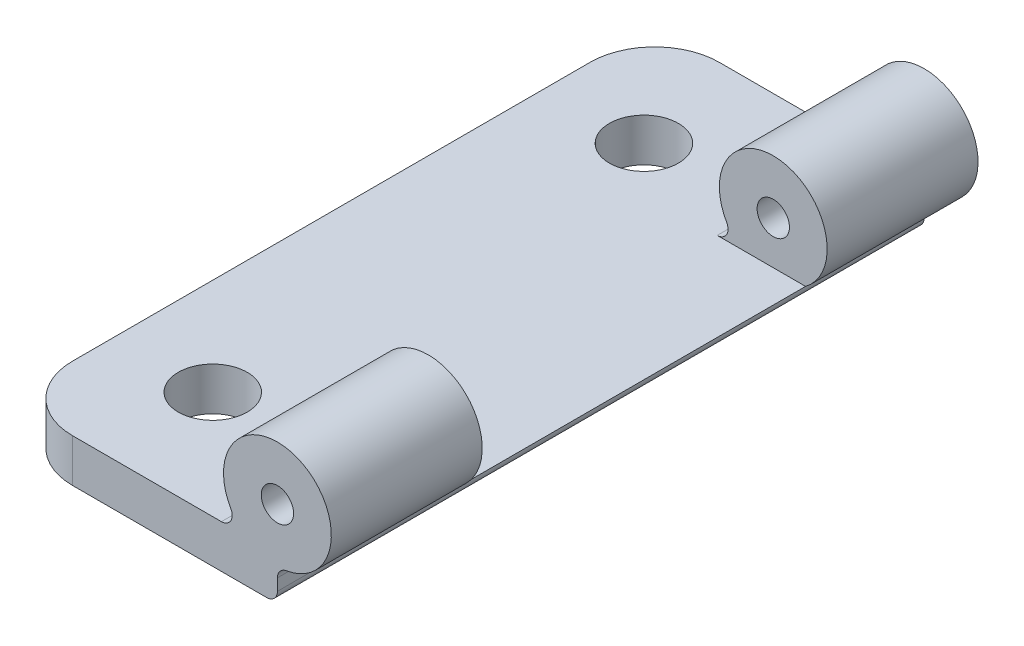
ISO-10303-21;
HEADER;
FILE_DESCRIPTION(('STEP AP214'),'2;1');
FILE_NAME('part.step','',(''),(''),'','','');
FILE_SCHEMA(('AUTOMOTIVE_DESIGN { 1 0 10303 214 1 1 1 1 }'));
ENDSEC;
DATA;
#1=APPLICATION_CONTEXT('core data for automotive mechanical design processes');
#2=APPLICATION_PROTOCOL_DEFINITION('international standard','automotive_design',2000,#1);
#3=PRODUCT_CONTEXT('',#1,'mechanical');
#4=PRODUCT('Part','Part','',(#3));
#5=PRODUCT_RELATED_PRODUCT_CATEGORY('part','',(#4));
#6=PRODUCT_DEFINITION_FORMATION('','',#4);
#7=PRODUCT_DEFINITION_CONTEXT('part definition',#1,'design');
#8=PRODUCT_DEFINITION('design','',#6,#7);
#9=PRODUCT_DEFINITION_SHAPE('','',#8);
#10=(LENGTH_UNIT() NAMED_UNIT(*) SI_UNIT(.MILLI.,.METRE.));
#11=(NAMED_UNIT(*) PLANE_ANGLE_UNIT() SI_UNIT($,.RADIAN.));
#12=(NAMED_UNIT(*) SI_UNIT($,.STERADIAN.) SOLID_ANGLE_UNIT());
#13=UNCERTAINTY_MEASURE_WITH_UNIT(LENGTH_MEASURE(1.E-05),#10,'distance_accuracy_value','');
#14=(GEOMETRIC_REPRESENTATION_CONTEXT(3) GLOBAL_UNCERTAINTY_ASSIGNED_CONTEXT((#13)) GLOBAL_UNIT_ASSIGNED_CONTEXT((#10,
#11,#12)) REPRESENTATION_CONTEXT('',''));
#15=CARTESIAN_POINT('',(0.,0.,0.));
#16=DIRECTION('',(0.,0.,1.));
#17=DIRECTION('',(1.,0.,0.));
#18=AXIS2_PLACEMENT_3D('',#15,#16,#17);
#19=CARTESIAN_POINT('',(12.5,4.,-7.07106781186548));
#20=DIRECTION('',(0.,0.,1.));
#21=DIRECTION('',(1.,0.,0.));
#22=AXIS2_PLACEMENT_3D('',#19,#20,#21);
#23=CYLINDRICAL_SURFACE('',#22,2.5);
#24=CARTESIAN_POINT('',(12.5,4.,23.));
#25=DIRECTION('',(0.,0.,-1.));
#26=DIRECTION('',(-1.,0.,0.));
#27=AXIS2_PLACEMENT_3D('',#24,#25,#26);
#28=CIRCLE('',#27,2.5);
#29=CARTESIAN_POINT('',(14.,2.,23.));
#30=VERTEX_POINT('',#29);
#31=CARTESIAN_POINT('',(10.3349364905389,2.75,23.));
#32=VERTEX_POINT('',#31);
#33=EDGE_CURVE('E146',#30,#32,#28,.F.);
#34=ORIENTED_EDGE('',*,*,#33,.T.);
#35=DIRECTION('',(0.,0.,1.));
#36=VECTOR('',#35,1.);
#37=CARTESIAN_POINT('',(10.3349364905389,2.75,-7.07106781186548));
#38=LINE('',#37,#36);
#39=CARTESIAN_POINT('',(10.3349364905389,2.75,30.));
#40=VERTEX_POINT('',#39);
#41=EDGE_CURVE('E155',#32,#40,#38,.T.);
#42=ORIENTED_EDGE('',*,*,#41,.T.);
#43=CARTESIAN_POINT('',(12.5,4.,30.));
#44=DIRECTION('',(0.,0.,1.));
#45=DIRECTION('',(1.,0.,0.));
#46=AXIS2_PLACEMENT_3D('',#43,#44,#45);
#47=CIRCLE('',#46,2.5);
#48=CARTESIAN_POINT('',(12.9166666666667,1.53496675704183,30.));
#49=VERTEX_POINT('',#48);
#50=EDGE_CURVE('E200',#49,#40,#47,.T.);
#51=ORIENTED_EDGE('',*,*,#50,.F.);
#52=DIRECTION('',(0.,0.,1.));
#53=VECTOR('',#52,1.);
#54=CARTESIAN_POINT('',(12.9166666666667,1.53496675704183,-7.07106781186548));
#55=LINE('',#54,#53);
#56=CARTESIAN_POINT('',(12.9166666666667,1.53496675704183,0.));
#57=VERTEX_POINT('',#56);
#58=EDGE_CURVE('E256',#49,#57,#55,.F.);
#59=ORIENTED_EDGE('',*,*,#58,.T.);
#60=CARTESIAN_POINT('',(12.5,4.,0.));
#61=DIRECTION('',(0.,0.,1.));
#62=DIRECTION('',(1.,0.,0.));
#63=AXIS2_PLACEMENT_3D('',#60,#61,#62);
#64=CIRCLE('',#63,2.5);
#65=CARTESIAN_POINT('',(10.3349364905389,2.75,0.));
#66=VERTEX_POINT('',#65);
#67=EDGE_CURVE('E205',#66,#57,#64,.F.);
#68=ORIENTED_EDGE('',*,*,#67,.F.);
#69=CARTESIAN_POINT('',(10.3349364905389,2.75,7.));
#70=VERTEX_POINT('',#69);
#71=EDGE_CURVE('E168',#66,#70,#38,.T.);
#72=ORIENTED_EDGE('',*,*,#71,.T.);
#73=CARTESIAN_POINT('',(12.5,4.,7.));
#74=DIRECTION('',(0.,0.,1.));
#75=DIRECTION('',(1.,0.,0.));
#76=AXIS2_PLACEMENT_3D('',#73,#74,#75);
#77=CIRCLE('',#76,2.5);
#78=CARTESIAN_POINT('',(14.,2.,7.));
#79=VERTEX_POINT('',#78);
#80=EDGE_CURVE('E188',#70,#79,#77,.F.);
#81=ORIENTED_EDGE('',*,*,#80,.T.);
#82=DIRECTION('',(0.,0.,1.));
#83=VECTOR('',#82,1.);
#84=CARTESIAN_POINT('',(14.,2.,-7.07106781186548));
#85=LINE('',#84,#83);
#86=EDGE_CURVE('E194',#79,#30,#85,.T.);
#87=ORIENTED_EDGE('',*,*,#86,.T.);
#88=EDGE_LOOP('',(#34,#42,#51,#59,#68,#72,#81,#87));
#89=FACE_BOUND('',#88,.T.);
#90=ADVANCED_FACE('F41',(#89),#23,.T.);
#91=CARTESIAN_POINT('',(9.90192378864669,2.5,-7.07106781186548));
#92=DIRECTION('',(0.,0.,1.));
#93=DIRECTION('',(1.,0.,0.));
#94=AXIS2_PLACEMENT_3D('',#91,#92,#93);
#95=CYLINDRICAL_SURFACE('',#94,0.5);
#96=CARTESIAN_POINT('',(9.90192378864669,2.5,23.));
#97=DIRECTION('',(0.,0.,-1.));
#98=DIRECTION('',(-1.,0.,0.));
#99=AXIS2_PLACEMENT_3D('',#96,#97,#98);
#100=CIRCLE('',#99,0.5);
#101=CARTESIAN_POINT('',(9.90192378864669,2.,23.));
#102=VERTEX_POINT('',#101);
#103=EDGE_CURVE('E144',#102,#32,#100,.F.);
#104=ORIENTED_EDGE('',*,*,#103,.F.);
#105=DIRECTION('',(0.,0.,-1.));
#106=VECTOR('',#105,1.);
#107=CARTESIAN_POINT('',(9.90192378864669,2.,0.));
#108=LINE('',#107,#106);
#109=CARTESIAN_POINT('',(9.90192378864669,2.,30.));
#110=VERTEX_POINT('',#109);
#111=EDGE_CURVE('E154',#110,#102,#108,.T.);
#112=ORIENTED_EDGE('',*,*,#111,.F.);
#113=CARTESIAN_POINT('',(9.90192378864669,2.5,30.));
#114=DIRECTION('',(0.,0.,-1.));
#115=DIRECTION('',(-1.,0.,0.));
#116=AXIS2_PLACEMENT_3D('',#113,#114,#115);
#117=CIRCLE('',#116,0.5);
#118=EDGE_CURVE('E179',#40,#110,#117,.T.);
#119=ORIENTED_EDGE('',*,*,#118,.F.);
#120=ORIENTED_EDGE('',*,*,#41,.F.);
#121=EDGE_LOOP('',(#104,#112,#119,#120));
#122=FACE_BOUND('',#121,.T.);
#123=ADVANCED_FACE('F152',(#122),#95,.F.);
#124=CARTESIAN_POINT('',(9.90192378864669,2.5,7.));
#125=DIRECTION('',(0.,0.,1.));
#126=DIRECTION('',(1.,0.,0.));
#127=AXIS2_PLACEMENT_3D('',#124,#125,#126);
#128=CIRCLE('',#127,0.5);
#129=CARTESIAN_POINT('',(9.90192378864669,2.,7.));
#130=VERTEX_POINT('',#129);
#131=EDGE_CURVE('E185',#70,#130,#128,.F.);
#132=ORIENTED_EDGE('',*,*,#131,.F.);
#133=ORIENTED_EDGE('',*,*,#71,.F.);
#134=CARTESIAN_POINT('',(9.90192378864669,2.5,0.));
#135=DIRECTION('',(0.,0.,1.));
#136=DIRECTION('',(1.,0.,0.));
#137=AXIS2_PLACEMENT_3D('',#134,#135,#136);
#138=CIRCLE('',#137,0.5);
#139=CARTESIAN_POINT('',(9.90192378864669,2.,0.));
#140=VERTEX_POINT('',#139);
#141=EDGE_CURVE('E181',#140,#66,#138,.T.);
#142=ORIENTED_EDGE('',*,*,#141,.F.);
#143=EDGE_CURVE('E163',#130,#140,#108,.T.);
#144=ORIENTED_EDGE('',*,*,#143,.F.);
#145=EDGE_LOOP('',(#132,#133,#142,#144));
#146=FACE_BOUND('',#145,.T.);
#147=ADVANCED_FACE('F266',(#146),#95,.F.);
#148=CARTESIAN_POINT('',(12.5,4.,0.));
#149=DIRECTION('',(0.,0.,1.));
#150=DIRECTION('',(1.,0.,0.));
#151=AXIS2_PLACEMENT_3D('',#148,#149,#150);
#152=CYLINDRICAL_SURFACE('',#151,0.75);
#153=CARTESIAN_POINT('',(12.5,4.,30.));
#154=DIRECTION('',(0.,0.,1.));
#155=DIRECTION('',(1.,0.,0.));
#156=AXIS2_PLACEMENT_3D('',#153,#154,#155);
#157=CIRCLE('',#156,0.75);
#158=CARTESIAN_POINT('',(13.25,4.,30.));
#159=VERTEX_POINT('',#158);
#160=EDGE_CURVE('E196',#159,#159,#157,.T.);
#161=ORIENTED_EDGE('',*,*,#160,.T.);
#162=EDGE_LOOP('',(#161));
#163=FACE_BOUND('',#162,.T.);
#164=CARTESIAN_POINT('',(12.5,4.,23.));
#165=DIRECTION('',(0.,0.,-1.));
#166=DIRECTION('',(-1.,0.,0.));
#167=AXIS2_PLACEMENT_3D('',#164,#165,#166);
#168=CIRCLE('',#167,0.75);
#169=CARTESIAN_POINT('',(11.75,4.,23.));
#170=VERTEX_POINT('',#169);
#171=EDGE_CURVE('E45',#170,#170,#168,.F.);
#172=ORIENTED_EDGE('',*,*,#171,.F.);
#173=EDGE_LOOP('',(#172));
#174=FACE_BOUND('',#173,.T.);
#175=ADVANCED_FACE('F285',(#163,#174),#152,.F.);
#176=CARTESIAN_POINT('',(12.5,4.,0.));
#177=DIRECTION('',(0.,0.,1.));
#178=DIRECTION('',(1.,0.,0.));
#179=AXIS2_PLACEMENT_3D('',#176,#177,#178);
#180=CIRCLE('',#179,0.75);
#181=CARTESIAN_POINT('',(13.25,4.,0.));
#182=VERTEX_POINT('',#181);
#183=EDGE_CURVE('E197',#182,#182,#180,.T.);
#184=ORIENTED_EDGE('',*,*,#183,.F.);
#185=EDGE_LOOP('',(#184));
#186=FACE_BOUND('',#185,.T.);
#187=CARTESIAN_POINT('',(12.5,4.,7.));
#188=DIRECTION('',(0.,0.,1.));
#189=DIRECTION('',(1.,0.,0.));
#190=AXIS2_PLACEMENT_3D('',#187,#188,#189);
#191=CIRCLE('',#190,0.75);
#192=CARTESIAN_POINT('',(13.25,4.,7.));
#193=VERTEX_POINT('',#192);
#194=EDGE_CURVE('E183',#193,#193,#191,.F.);
#195=ORIENTED_EDGE('',*,*,#194,.F.);
#196=EDGE_LOOP('',(#195));
#197=FACE_BOUND('',#196,.T.);
#198=ADVANCED_FACE('F299',(#186,#197),#152,.F.);
#199=CARTESIAN_POINT('',(3.,2.,27.));
#200=DIRECTION('',(0.,1.,0.));
#201=DIRECTION('',(0.,0.,1.));
#202=AXIS2_PLACEMENT_3D('',#199,#200,#201);
#203=PLANE('',#202);
#204=DIRECTION('',(1.,0.,0.));
#205=VECTOR('',#204,1.);
#206=CARTESIAN_POINT('',(3.00000000000002,2.,30.));
#207=LINE('',#206,#205);
#208=CARTESIAN_POINT('',(3.00000000000002,2.,30.));
#209=VERTEX_POINT('',#208);
#210=EDGE_CURVE('E161',#209,#110,#207,.T.);
#211=ORIENTED_EDGE('',*,*,#210,.T.);
#212=ORIENTED_EDGE('',*,*,#111,.T.);
#213=DIRECTION('',(1.,0.,0.));
#214=VECTOR('',#213,1.);
#215=CARTESIAN_POINT('',(9.90192378864669,2.,23.));
#216=LINE('',#215,#214);
#217=EDGE_CURVE('E140',#102,#30,#216,.T.);
#218=ORIENTED_EDGE('',*,*,#217,.T.);
#219=ORIENTED_EDGE('',*,*,#86,.F.);
#220=DIRECTION('',(-1.,0.,0.));
#221=VECTOR('',#220,1.);
#222=CARTESIAN_POINT('',(9.90192378864669,2.,7.));
#223=LINE('',#222,#221);
#224=EDGE_CURVE('E58',#79,#130,#223,.T.);
#225=ORIENTED_EDGE('',*,*,#224,.T.);
#226=ORIENTED_EDGE('',*,*,#143,.T.);
#227=DIRECTION('',(-1.,0.,0.));
#228=VECTOR('',#227,1.);
#229=CARTESIAN_POINT('',(3.00000000000002,2.,0.));
#230=LINE('',#229,#228);
#231=CARTESIAN_POINT('',(3.00000000000002,2.,0.));
#232=VERTEX_POINT('',#231);
#233=EDGE_CURVE('E221',#140,#232,#230,.T.);
#234=ORIENTED_EDGE('',*,*,#233,.T.);
#235=CARTESIAN_POINT('',(3.,2.,3.));
#236=DIRECTION('',(0.,1.,0.));
#237=DIRECTION('',(0.,0.,1.));
#238=AXIS2_PLACEMENT_3D('',#235,#236,#237);
#239=CIRCLE('',#238,3.);
#240=CARTESIAN_POINT('',(0.,2.,3.00000000000002));
#241=VERTEX_POINT('',#240);
#242=EDGE_CURVE('E223',#232,#241,#239,.T.);
#243=ORIENTED_EDGE('',*,*,#242,.T.);
#244=DIRECTION('',(0.,0.,1.));
#245=VECTOR('',#244,1.);
#246=CARTESIAN_POINT('',(0.,2.,3.00000000000002));
#247=LINE('',#246,#245);
#248=CARTESIAN_POINT('',(0.,2.,27.));
#249=VERTEX_POINT('',#248);
#250=EDGE_CURVE('E226',#241,#249,#247,.T.);
#251=ORIENTED_EDGE('',*,*,#250,.T.);
#252=CARTESIAN_POINT('',(3.,2.,27.));
#253=DIRECTION('',(0.,1.,0.));
#254=DIRECTION('',(0.,0.,1.));
#255=AXIS2_PLACEMENT_3D('',#252,#253,#254);
#256=CIRCLE('',#255,3.);
#257=EDGE_CURVE('E228',#249,#209,#256,.T.);
#258=ORIENTED_EDGE('',*,*,#257,.T.);
#259=EDGE_LOOP('',(#211,#212,#218,#219,#225,#226,#234,#243,#251,#258));
#260=FACE_BOUND('',#259,.T.);
#261=CARTESIAN_POINT('',(4.5,2.,5.));
#262=DIRECTION('',(0.,1.,0.));
#263=DIRECTION('',(0.,0.,1.));
#264=AXIS2_PLACEMENT_3D('',#261,#262,#263);
#265=CIRCLE('',#264,1.6);
#266=CARTESIAN_POINT('',(4.5,2.,6.6));
#267=VERTEX_POINT('',#266);
#268=EDGE_CURVE('E215',#267,#267,#265,.T.);
#269=ORIENTED_EDGE('',*,*,#268,.F.);
#270=EDGE_LOOP('',(#269));
#271=FACE_BOUND('',#270,.T.);
#272=CARTESIAN_POINT('',(4.5,2.,25.));
#273=DIRECTION('',(0.,1.,0.));
#274=DIRECTION('',(0.,0.,1.));
#275=AXIS2_PLACEMENT_3D('',#272,#273,#274);
#276=CIRCLE('',#275,1.6);
#277=CARTESIAN_POINT('',(4.5,2.,26.6));
#278=VERTEX_POINT('',#277);
#279=EDGE_CURVE('E209',#278,#278,#276,.T.);
#280=ORIENTED_EDGE('',*,*,#279,.F.);
#281=EDGE_LOOP('',(#280));
#282=FACE_BOUND('',#281,.T.);
#283=ADVANCED_FACE('F158',(#260,#271,#282),#203,.T.);
#284=CARTESIAN_POINT('',(3.,0.,27.));
#285=DIRECTION('',(0.,1.,0.));
#286=DIRECTION('',(0.,0.,1.));
#287=AXIS2_PLACEMENT_3D('',#284,#285,#286);
#288=PLANE('',#287);
#289=DIRECTION('',(-1.,0.,0.));
#290=VECTOR('',#289,1.);
#291=CARTESIAN_POINT('',(3.00000000000002,0.,0.));
#292=LINE('',#291,#290);
#293=CARTESIAN_POINT('',(12.,0.,0.));
#294=VERTEX_POINT('',#293);
#295=CARTESIAN_POINT('',(3.00000000000002,0.,0.));
#296=VERTEX_POINT('',#295);
#297=EDGE_CURVE('E218',#294,#296,#292,.T.);
#298=ORIENTED_EDGE('',*,*,#297,.F.);
#299=DIRECTION('',(0.,0.,-1.));
#300=VECTOR('',#299,1.);
#301=CARTESIAN_POINT('',(12.,0.,27.));
#302=LINE('',#301,#300);
#303=CARTESIAN_POINT('',(12.,0.,30.));
#304=VERTEX_POINT('',#303);
#305=EDGE_CURVE('E66',#294,#304,#302,.F.);
#306=ORIENTED_EDGE('',*,*,#305,.T.);
#307=DIRECTION('',(1.,0.,0.));
#308=VECTOR('',#307,1.);
#309=CARTESIAN_POINT('',(3.00000000000002,0.,30.));
#310=LINE('',#309,#308);
#311=CARTESIAN_POINT('',(3.00000000000002,0.,30.));
#312=VERTEX_POINT('',#311);
#313=EDGE_CURVE('E224',#312,#304,#310,.T.);
#314=ORIENTED_EDGE('',*,*,#313,.F.);
#315=CARTESIAN_POINT('',(3.,0.,27.));
#316=DIRECTION('',(0.,1.,0.));
#317=DIRECTION('',(0.,0.,1.));
#318=AXIS2_PLACEMENT_3D('',#315,#316,#317);
#319=CIRCLE('',#318,3.);
#320=CARTESIAN_POINT('',(0.,0.,27.));
#321=VERTEX_POINT('',#320);
#322=EDGE_CURVE('E237',#321,#312,#319,.T.);
#323=ORIENTED_EDGE('',*,*,#322,.F.);
#324=DIRECTION('',(0.,0.,1.));
#325=VECTOR('',#324,1.);
#326=CARTESIAN_POINT('',(0.,0.,3.00000000000002));
#327=LINE('',#326,#325);
#328=CARTESIAN_POINT('',(0.,0.,3.00000000000002));
#329=VERTEX_POINT('',#328);
#330=EDGE_CURVE('E235',#329,#321,#327,.T.);
#331=ORIENTED_EDGE('',*,*,#330,.F.);
#332=CARTESIAN_POINT('',(3.,0.,3.));
#333=DIRECTION('',(0.,1.,0.));
#334=DIRECTION('',(0.,0.,1.));
#335=AXIS2_PLACEMENT_3D('',#332,#333,#334);
#336=CIRCLE('',#335,3.);
#337=EDGE_CURVE('E233',#296,#329,#336,.T.);
#338=ORIENTED_EDGE('',*,*,#337,.F.);
#339=EDGE_LOOP('',(#298,#306,#314,#323,#331,#338));
#340=FACE_BOUND('',#339,.T.);
#341=CARTESIAN_POINT('',(4.5,0.,5.));
#342=DIRECTION('',(0.,1.,0.));
#343=DIRECTION('',(0.,0.,1.));
#344=AXIS2_PLACEMENT_3D('',#341,#342,#343);
#345=CIRCLE('',#344,1.6);
#346=CARTESIAN_POINT('',(4.5,0.,6.6));
#347=VERTEX_POINT('',#346);
#348=EDGE_CURVE('E212',#347,#347,#345,.T.);
#349=ORIENTED_EDGE('',*,*,#348,.T.);
#350=EDGE_LOOP('',(#349));
#351=FACE_BOUND('',#350,.T.);
#352=CARTESIAN_POINT('',(4.5,0.,25.));
#353=DIRECTION('',(0.,1.,0.));
#354=DIRECTION('',(0.,0.,1.));
#355=AXIS2_PLACEMENT_3D('',#352,#353,#354);
#356=CIRCLE('',#355,1.6);
#357=CARTESIAN_POINT('',(4.5,0.,26.6));
#358=VERTEX_POINT('',#357);
#359=EDGE_CURVE('E208',#358,#358,#356,.T.);
#360=ORIENTED_EDGE('',*,*,#359,.T.);
#361=EDGE_LOOP('',(#360));
#362=FACE_BOUND('',#361,.T.);
#363=ADVANCED_FACE('F298',(#340,#351,#362),#288,.F.);
#364=CARTESIAN_POINT('',(12.5,2.,0.));
#365=DIRECTION('',(-1.,0.,0.));
#366=DIRECTION('',(0.,0.,1.));
#367=AXIS2_PLACEMENT_3D('',#364,#365,#366);
#368=PLANE('',#367);
#369=DIRECTION('',(0.,-1.,0.));
#370=VECTOR('',#369,1.);
#371=CARTESIAN_POINT('',(12.5,2.,30.));
#372=LINE('',#371,#370);
#373=CARTESIAN_POINT('',(12.5,1.04196010845019,30.));
#374=VERTEX_POINT('',#373);
#375=CARTESIAN_POINT('',(12.5,0.5,30.));
#376=VERTEX_POINT('',#375);
#377=EDGE_CURVE('E231',#374,#376,#372,.T.);
#378=ORIENTED_EDGE('',*,*,#377,.T.);
#379=DIRECTION('',(0.,0.,-1.));
#380=VECTOR('',#379,1.);
#381=CARTESIAN_POINT('',(12.5,0.5,0.));
#382=LINE('',#381,#380);
#383=CARTESIAN_POINT('',(12.5,0.5,0.));
#384=VERTEX_POINT('',#383);
#385=EDGE_CURVE('E166',#376,#384,#382,.T.);
#386=ORIENTED_EDGE('',*,*,#385,.T.);
#387=DIRECTION('',(0.,-1.,0.));
#388=VECTOR('',#387,1.);
#389=CARTESIAN_POINT('',(12.5,2.,0.));
#390=LINE('',#389,#388);
#391=CARTESIAN_POINT('',(12.5,1.04196010845019,0.));
#392=VERTEX_POINT('',#391);
#393=EDGE_CURVE('E254',#392,#384,#390,.T.);
#394=ORIENTED_EDGE('',*,*,#393,.F.);
#395=DIRECTION('',(0.,0.,1.));
#396=VECTOR('',#395,1.);
#397=CARTESIAN_POINT('',(12.5,1.04196010845019,0.));
#398=LINE('',#397,#396);
#399=EDGE_CURVE('E162',#392,#374,#398,.T.);
#400=ORIENTED_EDGE('',*,*,#399,.T.);
#401=EDGE_LOOP('',(#378,#386,#394,#400));
#402=FACE_BOUND('',#401,.T.);
#403=ADVANCED_FACE('F302',(#402),#368,.F.);
#404=CARTESIAN_POINT('',(3.00000000000002,2.,0.));
#405=DIRECTION('',(0.,0.,1.));
#406=DIRECTION('',(1.,0.,0.));
#407=AXIS2_PLACEMENT_3D('',#404,#405,#406);
#408=PLANE('',#407);
#409=ORIENTED_EDGE('',*,*,#183,.T.);
#410=EDGE_LOOP('',(#409));
#411=FACE_BOUND('',#410,.T.);
#412=ORIENTED_EDGE('',*,*,#393,.T.);
#413=CARTESIAN_POINT('',(12.,0.5,0.));
#414=DIRECTION('',(0.,0.,1.));
#415=DIRECTION('',(1.,0.,0.));
#416=AXIS2_PLACEMENT_3D('',#413,#414,#415);
#417=CIRCLE('',#416,0.5);
#418=EDGE_CURVE('E174',#384,#294,#417,.F.);
#419=ORIENTED_EDGE('',*,*,#418,.T.);
#420=ORIENTED_EDGE('',*,*,#297,.T.);
#421=DIRECTION('',(0.,-1.,0.));
#422=VECTOR('',#421,1.);
#423=CARTESIAN_POINT('',(3.00000000000002,2.,0.));
#424=LINE('',#423,#422);
#425=EDGE_CURVE('E251',#232,#296,#424,.T.);
#426=ORIENTED_EDGE('',*,*,#425,.F.);
#427=ORIENTED_EDGE('',*,*,#233,.F.);
#428=ORIENTED_EDGE('',*,*,#141,.T.);
#429=ORIENTED_EDGE('',*,*,#67,.T.);
#430=CARTESIAN_POINT('',(13.,1.04196010845019,0.));
#431=DIRECTION('',(0.,0.,1.));
#432=DIRECTION('',(1.,0.,0.));
#433=AXIS2_PLACEMENT_3D('',#430,#431,#432);
#434=CIRCLE('',#433,0.5);
#435=EDGE_CURVE('E11',#57,#392,#434,.T.);
#436=ORIENTED_EDGE('',*,*,#435,.T.);
#437=EDGE_LOOP('',(#412,#419,#420,#426,#427,#428,#429,#436));
#438=FACE_BOUND('',#437,.T.);
#439=ADVANCED_FACE('F316',(#411,#438),#408,.F.);
#440=CARTESIAN_POINT('',(3.,2.,3.));
#441=DIRECTION('',(0.,-1.,0.));
#442=DIRECTION('',(0.,0.,-1.));
#443=AXIS2_PLACEMENT_3D('',#440,#441,#442);
#444=CYLINDRICAL_SURFACE('',#443,3.);
#445=ORIENTED_EDGE('',*,*,#337,.T.);
#446=DIRECTION('',(0.,-1.,0.));
#447=VECTOR('',#446,1.);
#448=CARTESIAN_POINT('',(0.,2.,3.00000000000002));
#449=LINE('',#448,#447);
#450=EDGE_CURVE('E248',#241,#329,#449,.T.);
#451=ORIENTED_EDGE('',*,*,#450,.F.);
#452=ORIENTED_EDGE('',*,*,#242,.F.);
#453=ORIENTED_EDGE('',*,*,#425,.T.);
#454=EDGE_LOOP('',(#445,#451,#452,#453));
#455=FACE_BOUND('',#454,.T.);
#456=ADVANCED_FACE('F312',(#455),#444,.T.);
#457=CARTESIAN_POINT('',(0.,2.,3.00000000000002));
#458=DIRECTION('',(1.,0.,0.));
#459=DIRECTION('',(0.,0.,-1.));
#460=AXIS2_PLACEMENT_3D('',#457,#458,#459);
#461=PLANE('',#460);
#462=ORIENTED_EDGE('',*,*,#330,.T.);
#463=DIRECTION('',(0.,-1.,0.));
#464=VECTOR('',#463,1.);
#465=CARTESIAN_POINT('',(0.,2.,27.));
#466=LINE('',#465,#464);
#467=EDGE_CURVE('E245',#249,#321,#466,.T.);
#468=ORIENTED_EDGE('',*,*,#467,.F.);
#469=ORIENTED_EDGE('',*,*,#250,.F.);
#470=ORIENTED_EDGE('',*,*,#450,.T.);
#471=EDGE_LOOP('',(#462,#468,#469,#470));
#472=FACE_BOUND('',#471,.T.);
#473=ADVANCED_FACE('F308',(#472),#461,.F.);
#474=CARTESIAN_POINT('',(3.,2.,27.));
#475=DIRECTION('',(0.,-1.,0.));
#476=DIRECTION('',(0.,0.,-1.));
#477=AXIS2_PLACEMENT_3D('',#474,#475,#476);
#478=CYLINDRICAL_SURFACE('',#477,3.);
#479=ORIENTED_EDGE('',*,*,#322,.T.);
#480=DIRECTION('',(0.,-1.,0.));
#481=VECTOR('',#480,1.);
#482=CARTESIAN_POINT('',(3.00000000000002,2.,30.));
#483=LINE('',#482,#481);
#484=EDGE_CURVE('E242',#209,#312,#483,.T.);
#485=ORIENTED_EDGE('',*,*,#484,.F.);
#486=ORIENTED_EDGE('',*,*,#257,.F.);
#487=ORIENTED_EDGE('',*,*,#467,.T.);
#488=EDGE_LOOP('',(#479,#485,#486,#487));
#489=FACE_BOUND('',#488,.T.);
#490=ADVANCED_FACE('F304',(#489),#478,.T.);
#491=CARTESIAN_POINT('',(3.00000000000002,2.,30.));
#492=DIRECTION('',(0.,0.,-1.));
#493=DIRECTION('',(-1.,0.,0.));
#494=AXIS2_PLACEMENT_3D('',#491,#492,#493);
#495=PLANE('',#494);
#496=ORIENTED_EDGE('',*,*,#160,.F.);
#497=EDGE_LOOP('',(#496));
#498=FACE_BOUND('',#497,.T.);
#499=ORIENTED_EDGE('',*,*,#313,.T.);
#500=CARTESIAN_POINT('',(12.,0.5,30.));
#501=DIRECTION('',(0.,0.,-1.));
#502=DIRECTION('',(-1.,0.,0.));
#503=AXIS2_PLACEMENT_3D('',#500,#501,#502);
#504=CIRCLE('',#503,0.5);
#505=EDGE_CURVE('E177',#304,#376,#504,.F.);
#506=ORIENTED_EDGE('',*,*,#505,.T.);
#507=ORIENTED_EDGE('',*,*,#377,.F.);
#508=CARTESIAN_POINT('',(13.,1.04196010845019,30.));
#509=DIRECTION('',(0.,0.,-1.));
#510=DIRECTION('',(-1.,0.,0.));
#511=AXIS2_PLACEMENT_3D('',#508,#509,#510);
#512=CIRCLE('',#511,0.5);
#513=EDGE_CURVE('E50',#374,#49,#512,.T.);
#514=ORIENTED_EDGE('',*,*,#513,.T.);
#515=ORIENTED_EDGE('',*,*,#50,.T.);
#516=ORIENTED_EDGE('',*,*,#118,.T.);
#517=ORIENTED_EDGE('',*,*,#210,.F.);
#518=ORIENTED_EDGE('',*,*,#484,.T.);
#519=EDGE_LOOP('',(#499,#506,#507,#514,#515,#516,#517,#518));
#520=FACE_BOUND('',#519,.T.);
#521=ADVANCED_FACE('F294',(#498,#520),#495,.F.);
#522=CARTESIAN_POINT('',(4.5,2.,5.));
#523=DIRECTION('',(0.,-1.,0.));
#524=DIRECTION('',(0.,0.,-1.));
#525=AXIS2_PLACEMENT_3D('',#522,#523,#524);
#526=CYLINDRICAL_SURFACE('',#525,1.6);
#527=ORIENTED_EDGE('',*,*,#268,.T.);
#528=EDGE_LOOP('',(#527));
#529=FACE_BOUND('',#528,.T.);
#530=ORIENTED_EDGE('',*,*,#348,.F.);
#531=EDGE_LOOP('',(#530));
#532=FACE_BOUND('',#531,.T.);
#533=ADVANCED_FACE('F290',(#529,#532),#526,.F.);
#534=CARTESIAN_POINT('',(4.5,2.,25.));
#535=DIRECTION('',(0.,-1.,0.));
#536=DIRECTION('',(0.,0.,-1.));
#537=AXIS2_PLACEMENT_3D('',#534,#535,#536);
#538=CYLINDRICAL_SURFACE('',#537,1.6);
#539=ORIENTED_EDGE('',*,*,#279,.T.);
#540=EDGE_LOOP('',(#539));
#541=FACE_BOUND('',#540,.T.);
#542=ORIENTED_EDGE('',*,*,#359,.F.);
#543=EDGE_LOOP('',(#542));
#544=FACE_BOUND('',#543,.T.);
#545=ADVANCED_FACE('F286',(#541,#544),#538,.F.);
#546=CARTESIAN_POINT('',(12.,0.5,0.));
#547=DIRECTION('',(0.,0.,-1.));
#548=DIRECTION('',(-1.,0.,0.));
#549=AXIS2_PLACEMENT_3D('',#546,#547,#548);
#550=CYLINDRICAL_SURFACE('',#549,0.5);
#551=ORIENTED_EDGE('',*,*,#505,.F.);
#552=ORIENTED_EDGE('',*,*,#305,.F.);
#553=ORIENTED_EDGE('',*,*,#418,.F.);
#554=ORIENTED_EDGE('',*,*,#385,.F.);
#555=EDGE_LOOP('',(#551,#552,#553,#554));
#556=FACE_BOUND('',#555,.T.);
#557=ADVANCED_FACE('F289',(#556),#550,.T.);
#558=CARTESIAN_POINT('',(13.,1.04196010845019,-7.07106781186548));
#559=DIRECTION('',(0.,0.,1.));
#560=DIRECTION('',(1.,0.,0.));
#561=AXIS2_PLACEMENT_3D('',#558,#559,#560);
#562=CYLINDRICAL_SURFACE('',#561,0.5);
#563=ORIENTED_EDGE('',*,*,#435,.F.);
#564=ORIENTED_EDGE('',*,*,#58,.F.);
#565=ORIENTED_EDGE('',*,*,#513,.F.);
#566=ORIENTED_EDGE('',*,*,#399,.F.);
#567=EDGE_LOOP('',(#563,#564,#565,#566));
#568=FACE_BOUND('',#567,.T.);
#569=ADVANCED_FACE('F43',(#568),#562,.F.);
#570=CARTESIAN_POINT('',(9.90192378864669,6.5,23.));
#571=DIRECTION('',(0.,0.,-1.));
#572=DIRECTION('',(-1.,0.,0.));
#573=AXIS2_PLACEMENT_3D('',#570,#571,#572);
#574=PLANE('',#573);
#575=ORIENTED_EDGE('',*,*,#217,.F.);
#576=ORIENTED_EDGE('',*,*,#103,.T.);
#577=ORIENTED_EDGE('',*,*,#33,.F.);
#578=EDGE_LOOP('',(#575,#576,#577));
#579=FACE_BOUND('',#578,.T.);
#580=ORIENTED_EDGE('',*,*,#171,.T.);
#581=EDGE_LOOP('',(#580));
#582=FACE_BOUND('',#581,.T.);
#583=ADVANCED_FACE('F142',(#579,#582),#574,.T.);
#584=CARTESIAN_POINT('',(9.90192378864669,6.5,7.));
#585=DIRECTION('',(0.,0.,1.));
#586=DIRECTION('',(1.,0.,0.));
#587=AXIS2_PLACEMENT_3D('',#584,#585,#586);
#588=PLANE('',#587);
#589=ORIENTED_EDGE('',*,*,#80,.F.);
#590=ORIENTED_EDGE('',*,*,#131,.T.);
#591=ORIENTED_EDGE('',*,*,#224,.F.);
#592=EDGE_LOOP('',(#589,#590,#591));
#593=FACE_BOUND('',#592,.T.);
#594=ORIENTED_EDGE('',*,*,#194,.T.);
#595=EDGE_LOOP('',(#594));
#596=FACE_BOUND('',#595,.T.);
#597=ADVANCED_FACE('F269',(#593,#596),#588,.T.);
#598=CLOSED_SHELL('',(#90,#123,#147,#175,#198,#283,#363,#403,#439,#456,#473,#490,#521,#533,#545,
#557,#569,#583,#597));
#599=MANIFOLD_SOLID_BREP('B2',#598);
#600=ADVANCED_BREP_SHAPE_REPRESENTATION('',(#18,#599),#14);
#601=SHAPE_DEFINITION_REPRESENTATION(#9,#600);
ENDSEC;
END-ISO-10303-21;
